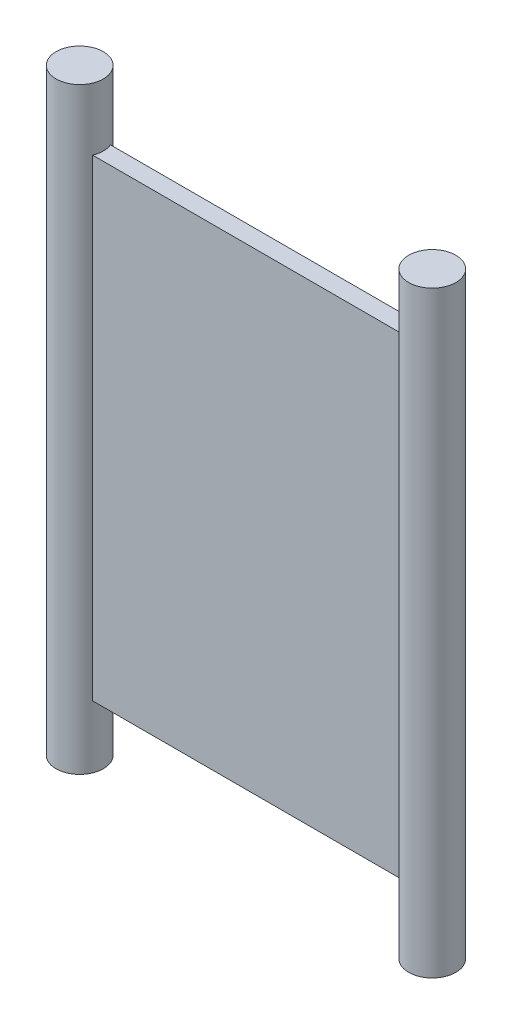
ISO-10303-21;
HEADER;
FILE_DESCRIPTION(('STEP AP214'),'2;1');
FILE_NAME('part.step','',(''),(''),'','','');
FILE_SCHEMA(('AUTOMOTIVE_DESIGN { 1 0 10303 214 1 1 1 1 }'));
ENDSEC;
DATA;
#1=APPLICATION_CONTEXT('core data for automotive mechanical design processes');
#2=APPLICATION_PROTOCOL_DEFINITION('international standard','automotive_design',2000,#1);
#3=PRODUCT_CONTEXT('',#1,'mechanical');
#4=PRODUCT('Part','Part','',(#3));
#5=PRODUCT_RELATED_PRODUCT_CATEGORY('part','',(#4));
#6=PRODUCT_DEFINITION_FORMATION('','',#4);
#7=PRODUCT_DEFINITION_CONTEXT('part definition',#1,'design');
#8=PRODUCT_DEFINITION('design','',#6,#7);
#9=PRODUCT_DEFINITION_SHAPE('','',#8);
#10=(LENGTH_UNIT() NAMED_UNIT(*) SI_UNIT(.MILLI.,.METRE.));
#11=(NAMED_UNIT(*) PLANE_ANGLE_UNIT() SI_UNIT($,.RADIAN.));
#12=(NAMED_UNIT(*) SI_UNIT($,.STERADIAN.) SOLID_ANGLE_UNIT());
#13=UNCERTAINTY_MEASURE_WITH_UNIT(LENGTH_MEASURE(1.E-05),#10,'distance_accuracy_value','');
#14=(GEOMETRIC_REPRESENTATION_CONTEXT(3) GLOBAL_UNCERTAINTY_ASSIGNED_CONTEXT((#13)) GLOBAL_UNIT_ASSIGNED_CONTEXT((#10,
#11,#12)) REPRESENTATION_CONTEXT('',''));
#15=CARTESIAN_POINT('',(0.,0.,0.));
#16=DIRECTION('',(0.,0.,1.));
#17=DIRECTION('',(1.,0.,0.));
#18=AXIS2_PLACEMENT_3D('',#15,#16,#17);
#19=CARTESIAN_POINT('',(9.885,26.5,0.499999999999999));
#20=DIRECTION('',(0.,0.,-1.));
#21=DIRECTION('',(-1.,0.,0.));
#22=AXIS2_PLACEMENT_3D('',#19,#20,#21);
#23=PLANE('',#22);
#24=DIRECTION('',(0.,-1.,0.));
#25=VECTOR('',#24,1.);
#26=CARTESIAN_POINT('',(8.6579608808192,30.,0.499999999999999));
#27=LINE('',#26,#25);
#28=CARTESIAN_POINT('',(8.6579608808192,26.5,0.499999999999999));
#29=VERTEX_POINT('',#28);
#30=CARTESIAN_POINT('',(8.6579608808192,0.,0.499999999999999));
#31=VERTEX_POINT('',#30);
#32=EDGE_CURVE('E53',#29,#31,#27,.T.);
#33=ORIENTED_EDGE('',*,*,#32,.F.);
#34=DIRECTION('',(1.,0.,0.));
#35=VECTOR('',#34,1.);
#36=CARTESIAN_POINT('',(9.885,26.5,0.499999999999999));
#37=LINE('',#36,#35);
#38=CARTESIAN_POINT('',(-8.65796088081919,26.5,0.500000000000001));
#39=VERTEX_POINT('',#38);
#40=EDGE_CURVE('E90',#39,#29,#37,.T.);
#41=ORIENTED_EDGE('',*,*,#40,.F.);
#42=DIRECTION('',(0.,-1.,0.));
#43=VECTOR('',#42,1.);
#44=CARTESIAN_POINT('',(-8.65796088081919,30.,0.500000000000001));
#45=LINE('',#44,#43);
#46=CARTESIAN_POINT('',(-8.65796088081919,0.,0.500000000000001));
#47=VERTEX_POINT('',#46);
#48=EDGE_CURVE('E103',#47,#39,#45,.F.);
#49=ORIENTED_EDGE('',*,*,#48,.F.);
#50=DIRECTION('',(1.,0.,0.));
#51=VECTOR('',#50,1.);
#52=CARTESIAN_POINT('',(9.885,0.,0.499999999999999));
#53=LINE('',#52,#51);
#54=EDGE_CURVE('E91',#47,#31,#53,.T.);
#55=ORIENTED_EDGE('',*,*,#54,.T.);
#56=EDGE_LOOP('',(#33,#41,#49,#55));
#57=FACE_BOUND('',#56,.T.);
#58=ADVANCED_FACE('F39',(#57),#23,.F.);
#59=CARTESIAN_POINT('',(9.885,26.5,-0.500000000000001));
#60=DIRECTION('',(0.,0.,1.));
#61=DIRECTION('',(1.,0.,0.));
#62=AXIS2_PLACEMENT_3D('',#59,#60,#61);
#63=PLANE('',#62);
#64=DIRECTION('',(0.,-1.,0.));
#65=VECTOR('',#64,1.);
#66=CARTESIAN_POINT('',(8.6579608808192,30.,-0.500000000000001));
#67=LINE('',#66,#65);
#68=CARTESIAN_POINT('',(8.6579608808192,0.,-0.500000000000001));
#69=VERTEX_POINT('',#68);
#70=CARTESIAN_POINT('',(8.6579608808192,26.5,-0.500000000000001));
#71=VERTEX_POINT('',#70);
#72=EDGE_CURVE('E78',#69,#71,#67,.F.);
#73=ORIENTED_EDGE('',*,*,#72,.F.);
#74=DIRECTION('',(-1.,0.,0.));
#75=VECTOR('',#74,1.);
#76=CARTESIAN_POINT('',(9.885,0.,-0.500000000000001));
#77=LINE('',#76,#75);
#78=CARTESIAN_POINT('',(-8.65796088081919,0.,-0.499999999999999));
#79=VERTEX_POINT('',#78);
#80=EDGE_CURVE('E60',#69,#79,#77,.T.);
#81=ORIENTED_EDGE('',*,*,#80,.T.);
#82=DIRECTION('',(0.,-1.,0.));
#83=VECTOR('',#82,1.);
#84=CARTESIAN_POINT('',(-8.65796088081919,30.,-0.499999999999999));
#85=LINE('',#84,#83);
#86=CARTESIAN_POINT('',(-8.65796088081919,26.5,-0.499999999999999));
#87=VERTEX_POINT('',#86);
#88=EDGE_CURVE('E105',#87,#79,#85,.T.);
#89=ORIENTED_EDGE('',*,*,#88,.F.);
#90=DIRECTION('',(-1.,0.,0.));
#91=VECTOR('',#90,1.);
#92=CARTESIAN_POINT('',(9.885,26.5,-0.500000000000001));
#93=LINE('',#92,#91);
#94=EDGE_CURVE('E85',#71,#87,#93,.T.);
#95=ORIENTED_EDGE('',*,*,#94,.F.);
#96=EDGE_LOOP('',(#73,#81,#89,#95));
#97=FACE_BOUND('',#96,.T.);
#98=ADVANCED_FACE('F84',(#97),#63,.F.);
#99=CARTESIAN_POINT('',(-9.885,30.,0.));
#100=DIRECTION('',(0.,-1.,0.));
#101=DIRECTION('',(0.,0.,-1.));
#102=AXIS2_PLACEMENT_3D('',#99,#100,#101);
#103=CYLINDRICAL_SURFACE('',#102,1.325);
#104=CARTESIAN_POINT('',(-9.885,30.,0.));
#105=DIRECTION('',(0.,1.,0.));
#106=DIRECTION('',(0.,0.,1.));
#107=AXIS2_PLACEMENT_3D('',#104,#105,#106);
#108=CIRCLE('',#107,1.325);
#109=CARTESIAN_POINT('',(-9.885,30.,1.325));
#110=VERTEX_POINT('',#109);
#111=EDGE_CURVE('E107',#110,#110,#108,.T.);
#112=ORIENTED_EDGE('',*,*,#111,.F.);
#113=EDGE_LOOP('',(#112));
#114=FACE_BOUND('',#113,.T.);
#115=CARTESIAN_POINT('',(-9.885,-3.5,0.));
#116=DIRECTION('',(0.,1.,0.));
#117=DIRECTION('',(0.,0.,1.));
#118=AXIS2_PLACEMENT_3D('',#115,#116,#117);
#119=CIRCLE('',#118,1.325);
#120=CARTESIAN_POINT('',(-9.885,-3.5,1.325));
#121=VERTEX_POINT('',#120);
#122=EDGE_CURVE('E108',#121,#121,#119,.T.);
#123=ORIENTED_EDGE('',*,*,#122,.T.);
#124=EDGE_LOOP('',(#123));
#125=FACE_BOUND('',#124,.T.);
#126=ORIENTED_EDGE('',*,*,#48,.T.);
#127=CARTESIAN_POINT('',(-9.885,26.5,0.));
#128=DIRECTION('',(0.,-1.,0.));
#129=DIRECTION('',(0.,0.,-1.));
#130=AXIS2_PLACEMENT_3D('',#127,#128,#129);
#131=CIRCLE('',#130,1.325);
#132=EDGE_CURVE('E95',#39,#87,#131,.F.);
#133=ORIENTED_EDGE('',*,*,#132,.T.);
#134=ORIENTED_EDGE('',*,*,#88,.T.);
#135=CARTESIAN_POINT('',(-9.885,0.,0.));
#136=DIRECTION('',(0.,-1.,0.));
#137=DIRECTION('',(0.,0.,-1.));
#138=AXIS2_PLACEMENT_3D('',#135,#136,#137);
#139=CIRCLE('',#138,1.325);
#140=EDGE_CURVE('E46',#47,#79,#139,.F.);
#141=ORIENTED_EDGE('',*,*,#140,.F.);
#142=EDGE_LOOP('',(#126,#133,#134,#141));
#143=FACE_BOUND('',#142,.T.);
#144=ADVANCED_FACE('F138',(#114,#125,#143),#103,.T.);
#145=CARTESIAN_POINT('',(-9.885,30.,0.));
#146=DIRECTION('',(0.,1.,0.));
#147=DIRECTION('',(0.,0.,1.));
#148=AXIS2_PLACEMENT_3D('',#145,#146,#147);
#149=PLANE('',#148);
#150=ORIENTED_EDGE('',*,*,#111,.T.);
#151=EDGE_LOOP('',(#150));
#152=FACE_BOUND('',#151,.T.);
#153=ADVANCED_FACE('F144',(#152),#149,.T.);
#154=CARTESIAN_POINT('',(-9.885,-3.5,0.));
#155=DIRECTION('',(0.,1.,0.));
#156=DIRECTION('',(0.,0.,1.));
#157=AXIS2_PLACEMENT_3D('',#154,#155,#156);
#158=PLANE('',#157);
#159=ORIENTED_EDGE('',*,*,#122,.F.);
#160=EDGE_LOOP('',(#159));
#161=FACE_BOUND('',#160,.T.);
#162=ADVANCED_FACE('F150',(#161),#158,.F.);
#163=CARTESIAN_POINT('',(0.,26.5,0.));
#164=DIRECTION('',(0.,-1.,0.));
#165=DIRECTION('',(0.,0.,-1.));
#166=AXIS2_PLACEMENT_3D('',#163,#164,#165);
#167=PLANE('',#166);
#168=CARTESIAN_POINT('',(9.885,26.5,0.));
#169=DIRECTION('',(0.,-1.,0.));
#170=DIRECTION('',(0.,0.,-1.));
#171=AXIS2_PLACEMENT_3D('',#168,#169,#170);
#172=CIRCLE('',#171,1.325);
#173=EDGE_CURVE('E111',#71,#29,#172,.F.);
#174=ORIENTED_EDGE('',*,*,#173,.F.);
#175=ORIENTED_EDGE('',*,*,#94,.T.);
#176=ORIENTED_EDGE('',*,*,#132,.F.);
#177=ORIENTED_EDGE('',*,*,#40,.T.);
#178=EDGE_LOOP('',(#174,#175,#176,#177));
#179=FACE_BOUND('',#178,.T.);
#180=ADVANCED_FACE('F141',(#179),#167,.F.);
#181=CARTESIAN_POINT('',(0.,0.,0.));
#182=DIRECTION('',(0.,-1.,0.));
#183=DIRECTION('',(0.,0.,-1.));
#184=AXIS2_PLACEMENT_3D('',#181,#182,#183);
#185=PLANE('',#184);
#186=ORIENTED_EDGE('',*,*,#80,.F.);
#187=CARTESIAN_POINT('',(9.885,0.,0.));
#188=DIRECTION('',(0.,-1.,0.));
#189=DIRECTION('',(0.,0.,-1.));
#190=AXIS2_PLACEMENT_3D('',#187,#188,#189);
#191=CIRCLE('',#190,1.325);
#192=EDGE_CURVE('E11',#69,#31,#191,.F.);
#193=ORIENTED_EDGE('',*,*,#192,.T.);
#194=ORIENTED_EDGE('',*,*,#54,.F.);
#195=ORIENTED_EDGE('',*,*,#140,.T.);
#196=EDGE_LOOP('',(#186,#193,#194,#195));
#197=FACE_BOUND('',#196,.T.);
#198=ADVANCED_FACE('F89',(#197),#185,.T.);
#199=CARTESIAN_POINT('',(9.885,30.,0.));
#200=DIRECTION('',(0.,-1.,0.));
#201=DIRECTION('',(0.,0.,-1.));
#202=AXIS2_PLACEMENT_3D('',#199,#200,#201);
#203=CYLINDRICAL_SURFACE('',#202,1.325);
#204=CARTESIAN_POINT('',(9.885,30.,0.));
#205=DIRECTION('',(0.,1.,0.));
#206=DIRECTION('',(0.,0.,1.));
#207=AXIS2_PLACEMENT_3D('',#204,#205,#206);
#208=CIRCLE('',#207,1.325);
#209=CARTESIAN_POINT('',(9.885,30.,1.325));
#210=VERTEX_POINT('',#209);
#211=EDGE_CURVE('E116',#210,#210,#208,.T.);
#212=ORIENTED_EDGE('',*,*,#211,.F.);
#213=EDGE_LOOP('',(#212));
#214=FACE_BOUND('',#213,.T.);
#215=CARTESIAN_POINT('',(9.885,-3.5,0.));
#216=DIRECTION('',(0.,1.,0.));
#217=DIRECTION('',(0.,0.,1.));
#218=AXIS2_PLACEMENT_3D('',#215,#216,#217);
#219=CIRCLE('',#218,1.325);
#220=CARTESIAN_POINT('',(9.885,-3.5,1.325));
#221=VERTEX_POINT('',#220);
#222=EDGE_CURVE('E86',#221,#221,#219,.T.);
#223=ORIENTED_EDGE('',*,*,#222,.T.);
#224=EDGE_LOOP('',(#223));
#225=FACE_BOUND('',#224,.T.);
#226=ORIENTED_EDGE('',*,*,#72,.T.);
#227=ORIENTED_EDGE('',*,*,#173,.T.);
#228=ORIENTED_EDGE('',*,*,#32,.T.);
#229=ORIENTED_EDGE('',*,*,#192,.F.);
#230=EDGE_LOOP('',(#226,#227,#228,#229));
#231=FACE_BOUND('',#230,.T.);
#232=ADVANCED_FACE('F77',(#214,#225,#231),#203,.T.);
#233=CARTESIAN_POINT('',(9.885,30.,0.));
#234=DIRECTION('',(0.,1.,0.));
#235=DIRECTION('',(0.,0.,1.));
#236=AXIS2_PLACEMENT_3D('',#233,#234,#235);
#237=PLANE('',#236);
#238=ORIENTED_EDGE('',*,*,#211,.T.);
#239=EDGE_LOOP('',(#238));
#240=FACE_BOUND('',#239,.T.);
#241=ADVANCED_FACE('F125',(#240),#237,.T.);
#242=CARTESIAN_POINT('',(9.885,-3.5,0.));
#243=DIRECTION('',(0.,1.,0.));
#244=DIRECTION('',(0.,0.,1.));
#245=AXIS2_PLACEMENT_3D('',#242,#243,#244);
#246=PLANE('',#245);
#247=ORIENTED_EDGE('',*,*,#222,.F.);
#248=EDGE_LOOP('',(#247));
#249=FACE_BOUND('',#248,.T.);
#250=ADVANCED_FACE('F123',(#249),#246,.F.);
#251=CLOSED_SHELL('',(#58,#98,#144,#153,#162,#180,#198,#232,#241,#250));
#252=MANIFOLD_SOLID_BREP('B2',#251);
#253=ADVANCED_BREP_SHAPE_REPRESENTATION('',(#18,#252),#14);
#254=SHAPE_DEFINITION_REPRESENTATION(#9,#253);
ENDSEC;
END-ISO-10303-21;
